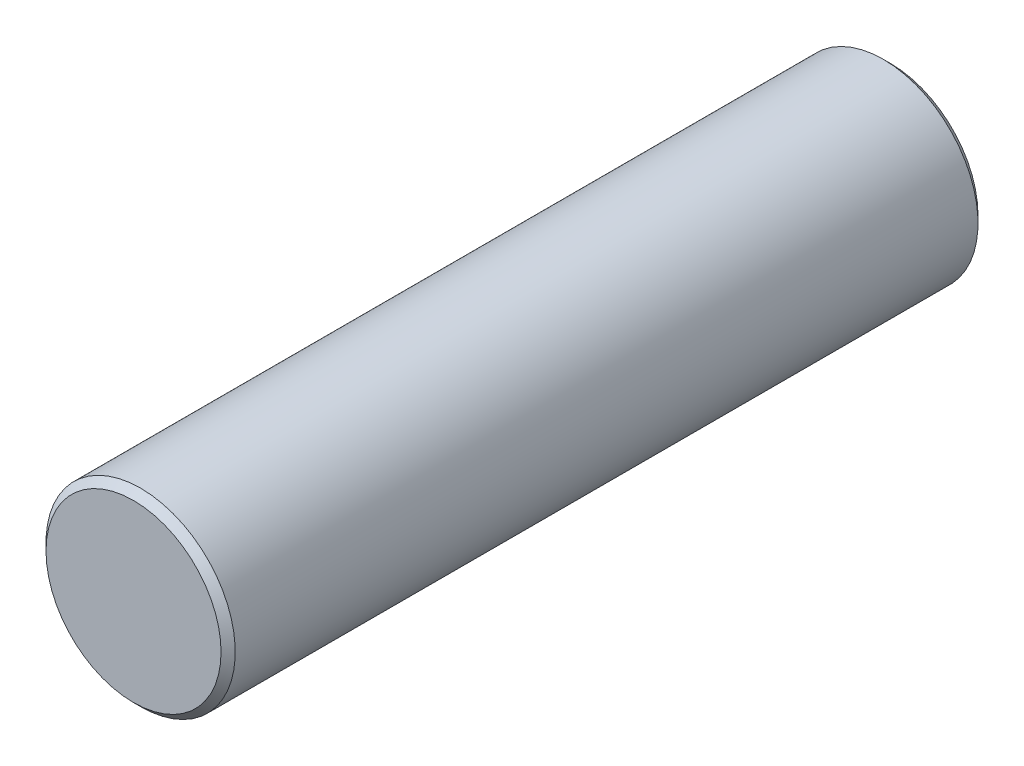
ISO-10303-21;
HEADER;
FILE_DESCRIPTION(('STEP AP214'),'2;1');
FILE_NAME('part.step','',(''),(''),'','','');
FILE_SCHEMA(('AUTOMOTIVE_DESIGN { 1 0 10303 214 1 1 1 1 }'));
ENDSEC;
DATA;
#1=APPLICATION_CONTEXT('core data for automotive mechanical design processes');
#2=APPLICATION_PROTOCOL_DEFINITION('international standard','automotive_design',2000,#1);
#3=PRODUCT_CONTEXT('',#1,'mechanical');
#4=PRODUCT('Part','Part','',(#3));
#5=PRODUCT_RELATED_PRODUCT_CATEGORY('part','',(#4));
#6=PRODUCT_DEFINITION_FORMATION('','',#4);
#7=PRODUCT_DEFINITION_CONTEXT('part definition',#1,'design');
#8=PRODUCT_DEFINITION('design','',#6,#7);
#9=PRODUCT_DEFINITION_SHAPE('','',#8);
#10=(LENGTH_UNIT() NAMED_UNIT(*) SI_UNIT(.MILLI.,.METRE.));
#11=(NAMED_UNIT(*) PLANE_ANGLE_UNIT() SI_UNIT($,.RADIAN.));
#12=(NAMED_UNIT(*) SI_UNIT($,.STERADIAN.) SOLID_ANGLE_UNIT());
#13=UNCERTAINTY_MEASURE_WITH_UNIT(LENGTH_MEASURE(1.E-05),#10,'distance_accuracy_value','');
#14=(GEOMETRIC_REPRESENTATION_CONTEXT(3) GLOBAL_UNCERTAINTY_ASSIGNED_CONTEXT((#13)) GLOBAL_UNIT_ASSIGNED_CONTEXT((#10,
#11,#12)) REPRESENTATION_CONTEXT('',''));
#15=CARTESIAN_POINT('',(0.,0.,0.));
#16=DIRECTION('',(0.,0.,1.));
#17=DIRECTION('',(1.,0.,0.));
#18=AXIS2_PLACEMENT_3D('',#15,#16,#17);
#19=CARTESIAN_POINT('',(0.,9.25,0.));
#20=DIRECTION('',(0.,0.,-1.));
#21=DIRECTION('',(0.,1.,0.));
#22=AXIS2_PLACEMENT_3D('',#19,#20,#21);
#23=PLANE('',#22);
#24=CARTESIAN_POINT('',(0.,0.,0.));
#25=DIRECTION('',(0.,0.,-1.));
#26=DIRECTION('',(0.,1.,0.));
#27=AXIS2_PLACEMENT_3D('',#24,#25,#26);
#28=CIRCLE('',#27,18.5);
#29=CARTESIAN_POINT('',(0.,18.5,0.));
#30=VERTEX_POINT('',#29);
#31=EDGE_CURVE('E9',#30,#30,#28,.T.);
#32=ORIENTED_EDGE('',*,*,#31,.T.);
#33=EDGE_LOOP('',(#32));
#34=FACE_BOUND('',#33,.T.);
#35=CARTESIAN_POINT('',(0.,0.,0.));
#36=DIRECTION('',(0.,0.,1.));
#37=DIRECTION('',(-1.,0.,0.));
#38=AXIS2_PLACEMENT_3D('',#35,#36,#37);
#39=CIRCLE('',#38,6.);
#40=CARTESIAN_POINT('',(-6.,0.,0.));
#41=VERTEX_POINT('',#40);
#42=EDGE_CURVE('E80',#41,#41,#39,.T.);
#43=ORIENTED_EDGE('',*,*,#42,.T.);
#44=EDGE_LOOP('',(#43));
#45=FACE_BOUND('',#44,.T.);
#46=ADVANCED_FACE('F15',(#34,#45),#23,.T.);
#47=CARTESIAN_POINT('',(0.,0.,0.75));
#48=DIRECTION('',(0.,0.,1.));
#49=DIRECTION('',(0.,1.,0.));
#50=AXIS2_PLACEMENT_3D('',#47,#48,#49);
#51=CONICAL_SURFACE('',#50,19.25,0.785398163397448);
#52=CARTESIAN_POINT('',(0.,0.,1.5));
#53=DIRECTION('',(0.,0.,-1.));
#54=DIRECTION('',(0.,1.,0.));
#55=AXIS2_PLACEMENT_3D('',#52,#53,#54);
#56=CIRCLE('',#55,20.);
#57=CARTESIAN_POINT('',(0.,20.,1.5));
#58=VERTEX_POINT('',#57);
#59=EDGE_CURVE('E25',#58,#58,#56,.T.);
#60=ORIENTED_EDGE('',*,*,#59,.T.);
#61=EDGE_LOOP('',(#60));
#62=FACE_BOUND('',#61,.T.);
#63=ORIENTED_EDGE('',*,*,#31,.F.);
#64=EDGE_LOOP('',(#63));
#65=FACE_BOUND('',#64,.T.);
#66=ADVANCED_FACE('F115',(#62,#65),#51,.T.);
#67=CARTESIAN_POINT('',(0.,0.,80.));
#68=DIRECTION('',(0.,0.,1.));
#69=DIRECTION('',(0.,1.,0.));
#70=AXIS2_PLACEMENT_3D('',#67,#68,#69);
#71=CYLINDRICAL_SURFACE('',#70,20.);
#72=CARTESIAN_POINT('',(0.,0.,158.5));
#73=DIRECTION('',(0.,0.,-1.));
#74=DIRECTION('',(0.,1.,0.));
#75=AXIS2_PLACEMENT_3D('',#72,#73,#74);
#76=CIRCLE('',#75,20.);
#77=CARTESIAN_POINT('',(0.,20.,158.5));
#78=VERTEX_POINT('',#77);
#79=EDGE_CURVE('E60',#78,#78,#76,.T.);
#80=ORIENTED_EDGE('',*,*,#79,.T.);
#81=EDGE_LOOP('',(#80));
#82=FACE_BOUND('',#81,.T.);
#83=ORIENTED_EDGE('',*,*,#59,.F.);
#84=EDGE_LOOP('',(#83));
#85=FACE_BOUND('',#84,.T.);
#86=CARTESIAN_POINT('',(0.,0.,6.5));
#87=DIRECTION('',(0.,0.,-1.));
#88=DIRECTION('',(0.,1.,0.));
#89=AXIS2_PLACEMENT_3D('',#86,#87,#88);
#90=CIRCLE('',#89,20.);
#91=CARTESIAN_POINT('',(10.5356537528527,-17.,6.5));
#92=VERTEX_POINT('',#91);
#93=CARTESIAN_POINT('',(-10.5356537528527,-17.,6.5));
#94=VERTEX_POINT('',#93);
#95=EDGE_CURVE('E19',#92,#94,#90,.T.);
#96=ORIENTED_EDGE('',*,*,#95,.T.);
#97=DIRECTION('',(0.,0.,1.));
#98=VECTOR('',#97,1.);
#99=CARTESIAN_POINT('',(-10.5356537528527,-17.,8.25));
#100=LINE('',#99,#98);
#101=CARTESIAN_POINT('',(-10.5356537528527,-17.,10.));
#102=VERTEX_POINT('',#101);
#103=EDGE_CURVE('E77',#94,#102,#100,.T.);
#104=ORIENTED_EDGE('',*,*,#103,.T.);
#105=CARTESIAN_POINT('',(0.,0.,10.));
#106=DIRECTION('',(0.,0.,1.));
#107=DIRECTION('',(0.,1.,0.));
#108=AXIS2_PLACEMENT_3D('',#105,#106,#107);
#109=CIRCLE('',#108,20.);
#110=CARTESIAN_POINT('',(10.5356537528527,-17.,10.));
#111=VERTEX_POINT('',#110);
#112=EDGE_CURVE('E71',#102,#111,#109,.T.);
#113=ORIENTED_EDGE('',*,*,#112,.T.);
#114=DIRECTION('',(0.,0.,-1.));
#115=VECTOR('',#114,1.);
#116=CARTESIAN_POINT('',(10.5356537528527,-17.,8.25));
#117=LINE('',#116,#115);
#118=EDGE_CURVE('E69',#111,#92,#117,.T.);
#119=ORIENTED_EDGE('',*,*,#118,.T.);
#120=EDGE_LOOP('',(#96,#104,#113,#119));
#121=FACE_BOUND('',#120,.T.);
#122=ADVANCED_FACE('F61',(#82,#85,#121),#71,.T.);
#123=CARTESIAN_POINT('',(0.,0.,159.25));
#124=DIRECTION('',(0.,0.,-1.));
#125=DIRECTION('',(0.,1.,0.));
#126=AXIS2_PLACEMENT_3D('',#123,#124,#125);
#127=CONICAL_SURFACE('',#126,19.25,0.785398163397448);
#128=CARTESIAN_POINT('',(0.,0.,160.));
#129=DIRECTION('',(0.,0.,-1.));
#130=DIRECTION('',(0.,1.,0.));
#131=AXIS2_PLACEMENT_3D('',#128,#129,#130);
#132=CIRCLE('',#131,18.5);
#133=CARTESIAN_POINT('',(0.,18.5,160.));
#134=VERTEX_POINT('',#133);
#135=EDGE_CURVE('E56',#134,#134,#132,.T.);
#136=ORIENTED_EDGE('',*,*,#135,.T.);
#137=EDGE_LOOP('',(#136));
#138=FACE_BOUND('',#137,.T.);
#139=ORIENTED_EDGE('',*,*,#79,.F.);
#140=EDGE_LOOP('',(#139));
#141=FACE_BOUND('',#140,.T.);
#142=ADVANCED_FACE('F111',(#138,#141),#127,.T.);
#143=CARTESIAN_POINT('',(0.,9.25,160.));
#144=DIRECTION('',(0.,0.,1.));
#145=DIRECTION('',(0.,-1.,0.));
#146=AXIS2_PLACEMENT_3D('',#143,#144,#145);
#147=PLANE('',#146);
#148=ORIENTED_EDGE('',*,*,#135,.F.);
#149=EDGE_LOOP('',(#148));
#150=FACE_BOUND('',#149,.T.);
#151=ADVANCED_FACE('F106',(#150),#147,.T.);
#152=CARTESIAN_POINT('',(0.,0.,26.4586213285198));
#153=DIRECTION('',(0.,0.,-1.));
#154=DIRECTION('',(-1.,0.,0.));
#155=AXIS2_PLACEMENT_3D('',#152,#153,#154);
#156=CONICAL_SURFACE('',#155,2.52640625,1.0471975511966);
#157=CARTESIAN_POINT('',(0.,0.,25.));
#158=DIRECTION('',(0.,0.,1.));
#159=DIRECTION('',(-1.,0.,0.));
#160=AXIS2_PLACEMENT_3D('',#157,#158,#159);
#161=CIRCLE('',#160,5.0528125);
#162=CARTESIAN_POINT('',(-5.0528125,0.,25.));
#163=VERTEX_POINT('',#162);
#164=EDGE_CURVE('E66',#163,#163,#161,.T.);
#165=ORIENTED_EDGE('',*,*,#164,.F.);
#166=EDGE_LOOP('',(#165));
#167=FACE_BOUND('',#166,.T.);
#168=CARTESIAN_POINT('',(0.,0.,27.9172426570397));
#169=VERTEX_POINT('',#168);
#170=VERTEX_LOOP('',#169);
#171=FACE_BOUND('',#170,.T.);
#172=ADVANCED_FACE('F17',(#167,#171),#156,.F.);
#173=CARTESIAN_POINT('',(0.,0.,12.97359375));
#174=DIRECTION('',(0.,0.,-1.));
#175=DIRECTION('',(-1.,0.,0.));
#176=AXIS2_PLACEMENT_3D('',#173,#174,#175);
#177=CYLINDRICAL_SURFACE('',#176,5.0528125);
#178=CARTESIAN_POINT('',(0.,0.,0.9471875));
#179=DIRECTION('',(0.,0.,1.));
#180=DIRECTION('',(-1.,0.,0.));
#181=AXIS2_PLACEMENT_3D('',#178,#179,#180);
#182=CIRCLE('',#181,5.0528125);
#183=CARTESIAN_POINT('',(-5.0528125,0.,0.9471875));
#184=VERTEX_POINT('',#183);
#185=EDGE_CURVE('E85',#184,#184,#182,.T.);
#186=ORIENTED_EDGE('',*,*,#185,.F.);
#187=EDGE_LOOP('',(#186));
#188=FACE_BOUND('',#187,.T.);
#189=ORIENTED_EDGE('',*,*,#164,.T.);
#190=EDGE_LOOP('',(#189));
#191=FACE_BOUND('',#190,.T.);
#192=ADVANCED_FACE('F94',(#188,#191),#177,.F.);
#193=CARTESIAN_POINT('',(0.,0.,0.47359375));
#194=DIRECTION('',(0.,0.,-1.));
#195=DIRECTION('',(-1.,0.,0.));
#196=AXIS2_PLACEMENT_3D('',#193,#194,#195);
#197=CONICAL_SURFACE('',#196,5.52640625,0.785398163397448);
#198=ORIENTED_EDGE('',*,*,#42,.F.);
#199=EDGE_LOOP('',(#198));
#200=FACE_BOUND('',#199,.T.);
#201=ORIENTED_EDGE('',*,*,#185,.T.);
#202=EDGE_LOOP('',(#201));
#203=FACE_BOUND('',#202,.T.);
#204=ADVANCED_FACE('F90',(#200,#203),#197,.F.);
#205=CARTESIAN_POINT('',(0.,-17.,8.25));
#206=DIRECTION('',(0.,-1.,0.));
#207=DIRECTION('',(0.,0.,-1.));
#208=AXIS2_PLACEMENT_3D('',#205,#206,#207);
#209=PLANE('',#208);
#210=ORIENTED_EDGE('',*,*,#103,.F.);
#211=DIRECTION('',(1.,0.,0.));
#212=VECTOR('',#211,1.);
#213=CARTESIAN_POINT('',(0.,-17.,6.5));
#214=LINE('',#213,#212);
#215=EDGE_CURVE('E75',#94,#92,#214,.T.);
#216=ORIENTED_EDGE('',*,*,#215,.T.);
#217=ORIENTED_EDGE('',*,*,#118,.F.);
#218=DIRECTION('',(-1.,0.,0.));
#219=VECTOR('',#218,1.);
#220=CARTESIAN_POINT('',(0.,-17.,10.));
#221=LINE('',#220,#219);
#222=EDGE_CURVE('E73',#111,#102,#221,.T.);
#223=ORIENTED_EDGE('',*,*,#222,.T.);
#224=EDGE_LOOP('',(#210,#216,#217,#223));
#225=FACE_BOUND('',#224,.T.);
#226=ADVANCED_FACE('F93',(#225),#209,.T.);
#227=CARTESIAN_POINT('',(0.,-19.5,6.5));
#228=DIRECTION('',(0.,0.,1.));
#229=DIRECTION('',(1.,0.,0.));
#230=AXIS2_PLACEMENT_3D('',#227,#228,#229);
#231=PLANE('',#230);
#232=ORIENTED_EDGE('',*,*,#95,.F.);
#233=ORIENTED_EDGE('',*,*,#215,.F.);
#234=EDGE_LOOP('',(#232,#233));
#235=FACE_BOUND('',#234,.T.);
#236=ADVANCED_FACE('F130',(#235),#231,.T.);
#237=CARTESIAN_POINT('',(0.,-19.5,10.));
#238=DIRECTION('',(0.,0.,1.));
#239=DIRECTION('',(1.,0.,0.));
#240=AXIS2_PLACEMENT_3D('',#237,#238,#239);
#241=PLANE('',#240);
#242=ORIENTED_EDGE('',*,*,#112,.F.);
#243=ORIENTED_EDGE('',*,*,#222,.F.);
#244=EDGE_LOOP('',(#242,#243));
#245=FACE_BOUND('',#244,.T.);
#246=ADVANCED_FACE('F128',(#245),#241,.F.);
#247=CLOSED_SHELL('',(#46,#66,#122,#142,#151,#172,#192,#204,#226,#236,#246));
#248=MANIFOLD_SOLID_BREP('B1',#247);
#249=ADVANCED_BREP_SHAPE_REPRESENTATION('',(#18,#248),#14);
#250=SHAPE_DEFINITION_REPRESENTATION(#9,#249);
ENDSEC;
END-ISO-10303-21;
